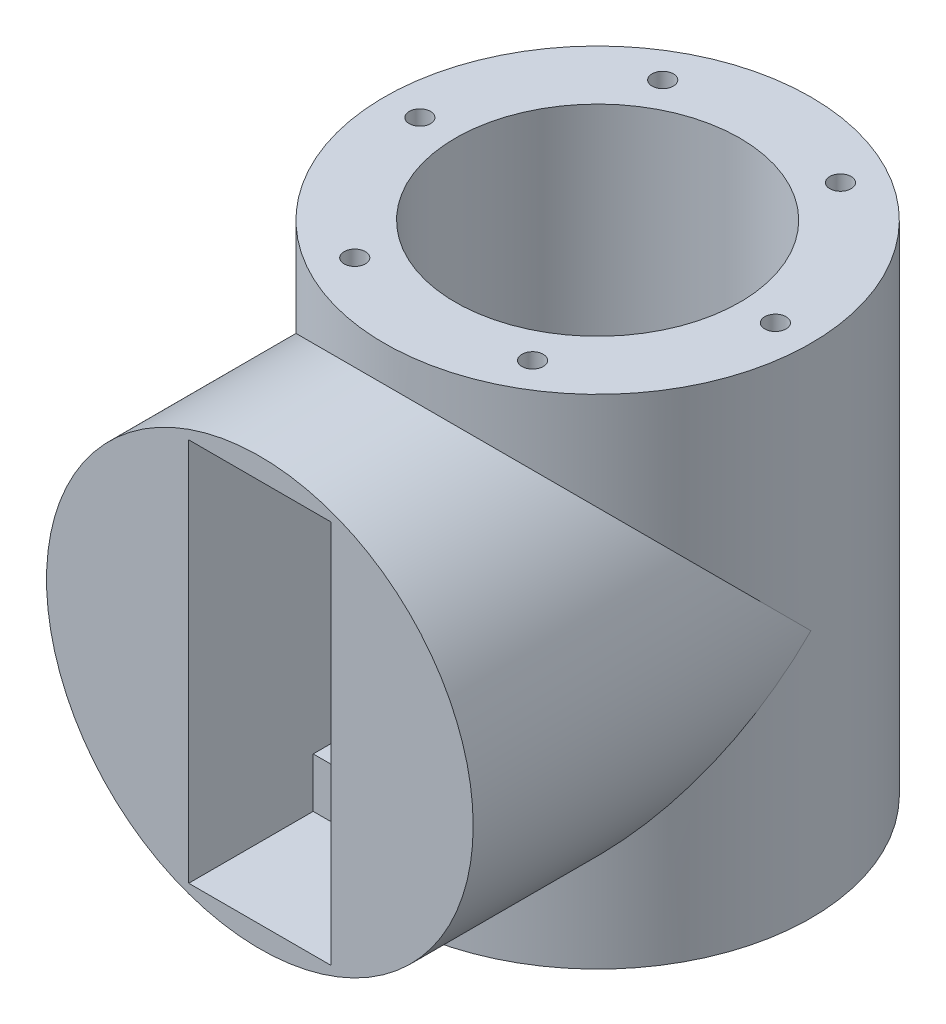
ISO-10303-21;
HEADER;
FILE_DESCRIPTION(('STEP AP214'),'2;1');
FILE_NAME('part.step','',(''),(''),'','','');
FILE_SCHEMA(('AUTOMOTIVE_DESIGN { 1 0 10303 214 1 1 1 1 }'));
ENDSEC;
DATA;
#1=APPLICATION_CONTEXT('core data for automotive mechanical design processes');
#2=APPLICATION_PROTOCOL_DEFINITION('international standard','automotive_design',2000,#1);
#3=PRODUCT_CONTEXT('',#1,'mechanical');
#4=PRODUCT('Part','Part','',(#3));
#5=PRODUCT_RELATED_PRODUCT_CATEGORY('part','',(#4));
#6=PRODUCT_DEFINITION_FORMATION('','',#4);
#7=PRODUCT_DEFINITION_CONTEXT('part definition',#1,'design');
#8=PRODUCT_DEFINITION('design','',#6,#7);
#9=PRODUCT_DEFINITION_SHAPE('','',#8);
#10=(LENGTH_UNIT() NAMED_UNIT(*) SI_UNIT(.MILLI.,.METRE.));
#11=(NAMED_UNIT(*) PLANE_ANGLE_UNIT() SI_UNIT($,.RADIAN.));
#12=(NAMED_UNIT(*) SI_UNIT($,.STERADIAN.) SOLID_ANGLE_UNIT());
#13=UNCERTAINTY_MEASURE_WITH_UNIT(LENGTH_MEASURE(1.E-05),#10,'distance_accuracy_value','');
#14=(GEOMETRIC_REPRESENTATION_CONTEXT(3) GLOBAL_UNCERTAINTY_ASSIGNED_CONTEXT((#13)) GLOBAL_UNIT_ASSIGNED_CONTEXT((#10,
#11,#12)) REPRESENTATION_CONTEXT('',''));
#15=CARTESIAN_POINT('',(0.,0.,0.));
#16=DIRECTION('',(0.,0.,1.));
#17=DIRECTION('',(1.,0.,0.));
#18=AXIS2_PLACEMENT_3D('',#15,#16,#17);
#19=CARTESIAN_POINT('',(-10.,55.,-30.001));
#20=DIRECTION('',(0.,1.,0.));
#21=DIRECTION('',(-1.,0.,0.));
#22=AXIS2_PLACEMENT_3D('',#19,#20,#21);
#23=PLANE('',#22);
#24=DIRECTION('',(1.,0.,0.));
#25=VECTOR('',#24,1.);
#26=CARTESIAN_POINT('',(-10.,55.,30.));
#27=LINE('',#26,#25);
#28=CARTESIAN_POINT('',(-10.,55.,30.));
#29=VERTEX_POINT('',#28);
#30=CARTESIAN_POINT('',(10.,55.,30.));
#31=VERTEX_POINT('',#30);
#32=EDGE_CURVE('E143',#29,#31,#27,.T.);
#33=ORIENTED_EDGE('',*,*,#32,.F.);
#34=DIRECTION('',(0.,0.,1.));
#35=VECTOR('',#34,1.);
#36=CARTESIAN_POINT('',(-10.,55.,-30.001));
#37=LINE('',#36,#35);
#38=CARTESIAN_POINT('',(-10.,55.,17.3205080756888));
#39=VERTEX_POINT('',#38);
#40=EDGE_CURVE('E162',#39,#29,#37,.T.);
#41=ORIENTED_EDGE('',*,*,#40,.F.);
#42=CARTESIAN_POINT('',(0.,55.,0.));
#43=DIRECTION('',(0.,1.,0.));
#44=DIRECTION('',(-1.,0.,0.));
#45=AXIS2_PLACEMENT_3D('',#42,#43,#44);
#46=CIRCLE('',#45,20.);
#47=CARTESIAN_POINT('',(10.,55.,17.3205080756888));
#48=VERTEX_POINT('',#47);
#49=EDGE_CURVE('E164',#48,#39,#46,.F.);
#50=ORIENTED_EDGE('',*,*,#49,.F.);
#51=DIRECTION('',(0.,0.,1.));
#52=VECTOR('',#51,1.);
#53=CARTESIAN_POINT('',(9.99999999999999,55.,-30.001));
#54=LINE('',#53,#52);
#55=EDGE_CURVE('E161',#48,#31,#54,.T.);
#56=ORIENTED_EDGE('',*,*,#55,.T.);
#57=EDGE_LOOP('',(#33,#41,#50,#56));
#58=FACE_BOUND('',#57,.T.);
#59=ADVANCED_FACE('F37',(#58),#23,.F.);
#60=CARTESIAN_POINT('',(-10.,15.,-30.001));
#61=DIRECTION('',(0.,-1.,0.));
#62=DIRECTION('',(0.,0.,-1.));
#63=AXIS2_PLACEMENT_3D('',#60,#61,#62);
#64=PLANE('',#63);
#65=DIRECTION('',(-1.,0.,0.));
#66=VECTOR('',#65,1.);
#67=CARTESIAN_POINT('',(-10.,15.,30.));
#68=LINE('',#67,#66);
#69=CARTESIAN_POINT('',(10.,15.,30.));
#70=VERTEX_POINT('',#69);
#71=CARTESIAN_POINT('',(-10.,15.,30.));
#72=VERTEX_POINT('',#71);
#73=EDGE_CURVE('E11',#70,#72,#68,.T.);
#74=ORIENTED_EDGE('',*,*,#73,.F.);
#75=DIRECTION('',(0.,0.,1.));
#76=VECTOR('',#75,1.);
#77=CARTESIAN_POINT('',(10.,15.,-30.001));
#78=LINE('',#77,#76);
#79=CARTESIAN_POINT('',(10.,15.,17.3205080756888));
#80=VERTEX_POINT('',#79);
#81=EDGE_CURVE('E154',#80,#70,#78,.T.);
#82=ORIENTED_EDGE('',*,*,#81,.F.);
#83=CARTESIAN_POINT('',(0.,15.,0.));
#84=DIRECTION('',(0.,-1.,0.));
#85=DIRECTION('',(0.,0.,-1.));
#86=AXIS2_PLACEMENT_3D('',#83,#84,#85);
#87=CIRCLE('',#86,20.);
#88=CARTESIAN_POINT('',(-10.,15.,17.3205080756888));
#89=VERTEX_POINT('',#88);
#90=EDGE_CURVE('E171',#89,#80,#87,.F.);
#91=ORIENTED_EDGE('',*,*,#90,.F.);
#92=DIRECTION('',(0.,0.,1.));
#93=VECTOR('',#92,1.);
#94=CARTESIAN_POINT('',(-10.,15.,-30.001));
#95=LINE('',#94,#93);
#96=EDGE_CURVE('E157',#89,#72,#95,.T.);
#97=ORIENTED_EDGE('',*,*,#96,.T.);
#98=EDGE_LOOP('',(#74,#82,#91,#97));
#99=FACE_BOUND('',#98,.T.);
#100=ADVANCED_FACE('F248',(#99),#64,.F.);
#101=CARTESIAN_POINT('',(0.,0.,0.));
#102=DIRECTION('',(0.,-1.,0.));
#103=DIRECTION('',(0.,0.,-1.));
#104=AXIS2_PLACEMENT_3D('',#101,#102,#103);
#105=CYLINDRICAL_SURFACE('',#104,30.);
#106=CARTESIAN_POINT('',(0.,70.,0.));
#107=DIRECTION('',(0.,-1.,0.));
#108=DIRECTION('',(0.,0.,-1.));
#109=AXIS2_PLACEMENT_3D('',#106,#107,#108);
#110=CIRCLE('',#109,30.);
#111=CARTESIAN_POINT('',(0.,70.,-30.));
#112=VERTEX_POINT('',#111);
#113=EDGE_CURVE('E226',#112,#112,#110,.T.);
#114=ORIENTED_EDGE('',*,*,#113,.T.);
#115=EDGE_LOOP('',(#114));
#116=FACE_BOUND('',#115,.T.);
#117=CARTESIAN_POINT('',(0.,0.,0.));
#118=DIRECTION('',(0.,-1.,0.));
#119=DIRECTION('',(0.,0.,-1.));
#120=AXIS2_PLACEMENT_3D('',#117,#118,#119);
#121=CIRCLE('',#120,30.);
#122=CARTESIAN_POINT('',(0.,0.,-30.));
#123=VERTEX_POINT('',#122);
#124=EDGE_CURVE('E223',#123,#123,#121,.T.);
#125=ORIENTED_EDGE('',*,*,#124,.F.);
#126=EDGE_LOOP('',(#125));
#127=FACE_BOUND('',#126,.T.);
#128=CARTESIAN_POINT('',(0.,35.,0.));
#129=DIRECTION('',(0.,-0.707106781186547,0.707106781186547));
#130=DIRECTION('',(0.,0.707106781186547,0.707106781186547));
#131=AXIS2_PLACEMENT_3D('',#128,#129,#130);
#132=ELLIPSE('',#131,42.4264068711928,30.);
#133=CARTESIAN_POINT('',(-30.,35.,0.));
#134=VERTEX_POINT('',#133);
#135=CARTESIAN_POINT('',(30.,35.,0.));
#136=VERTEX_POINT('',#135);
#137=EDGE_CURVE('E152',#134,#136,#132,.F.);
#138=ORIENTED_EDGE('',*,*,#137,.T.);
#139=CARTESIAN_POINT('',(0.,35.,0.));
#140=DIRECTION('',(0.,0.707106781186547,0.707106781186547));
#141=DIRECTION('',(0.,-0.707106781186547,0.707106781186547));
#142=AXIS2_PLACEMENT_3D('',#139,#140,#141);
#143=ELLIPSE('',#142,42.4264068711928,30.);
#144=EDGE_CURVE('E176',#136,#134,#143,.F.);
#145=ORIENTED_EDGE('',*,*,#144,.T.);
#146=EDGE_LOOP('',(#138,#145));
#147=FACE_BOUND('',#146,.T.);
#148=ADVANCED_FACE('F243',(#116,#127,#147),#105,.T.);
#149=CARTESIAN_POINT('',(0.,12.,-20.));
#150=DIRECTION('',(0.,1.,0.));
#151=DIRECTION('',(0.,0.,1.));
#152=AXIS2_PLACEMENT_3D('',#149,#150,#151);
#153=PLANE('',#152);
#154=CARTESIAN_POINT('',(0.,12.,-7.));
#155=DIRECTION('',(0.,1.,0.));
#156=DIRECTION('',(0.,0.,1.));
#157=AXIS2_PLACEMENT_3D('',#154,#155,#156);
#158=CIRCLE('',#157,1.5);
#159=CARTESIAN_POINT('',(0.,12.,-5.5));
#160=VERTEX_POINT('',#159);
#161=EDGE_CURVE('E200',#160,#160,#158,.T.);
#162=ORIENTED_EDGE('',*,*,#161,.F.);
#163=EDGE_LOOP('',(#162));
#164=FACE_BOUND('',#163,.T.);
#165=CARTESIAN_POINT('',(7.00000000000017,12.,-1.73225717501821E-13));
#166=DIRECTION('',(0.,1.,0.));
#167=DIRECTION('',(0.,0.,1.));
#168=AXIS2_PLACEMENT_3D('',#165,#166,#167);
#169=CIRCLE('',#168,1.50000000000014);
#170=CARTESIAN_POINT('',(7.00000000000017,12.,1.49999999999997));
#171=VERTEX_POINT('',#170);
#172=EDGE_CURVE('E201',#171,#171,#169,.T.);
#173=ORIENTED_EDGE('',*,*,#172,.F.);
#174=EDGE_LOOP('',(#173));
#175=FACE_BOUND('',#174,.T.);
#176=CARTESIAN_POINT('',(3.46451435003643E-13,12.,7.));
#177=DIRECTION('',(0.,1.,0.));
#178=DIRECTION('',(0.,0.,1.));
#179=AXIS2_PLACEMENT_3D('',#176,#177,#178);
#180=CIRCLE('',#179,1.50000000000038);
#181=CARTESIAN_POINT('',(3.46451435003643E-13,12.,8.50000000000038));
#182=VERTEX_POINT('',#181);
#183=EDGE_CURVE('E188',#182,#182,#180,.T.);
#184=ORIENTED_EDGE('',*,*,#183,.F.);
#185=EDGE_LOOP('',(#184));
#186=FACE_BOUND('',#185,.T.);
#187=CARTESIAN_POINT('',(-6.99999999999983,12.,1.74082970261225E-13));
#188=DIRECTION('',(0.,1.,0.));
#189=DIRECTION('',(0.,0.,1.));
#190=AXIS2_PLACEMENT_3D('',#187,#188,#189);
#191=CIRCLE('',#190,1.50000000000029);
#192=CARTESIAN_POINT('',(-6.99999999999983,12.,1.50000000000046));
#193=VERTEX_POINT('',#192);
#194=EDGE_CURVE('E189',#193,#193,#191,.T.);
#195=ORIENTED_EDGE('',*,*,#194,.F.);
#196=EDGE_LOOP('',(#195));
#197=FACE_BOUND('',#196,.T.);
#198=CARTESIAN_POINT('',(0.,12.,0.));
#199=DIRECTION('',(0.,-1.,0.));
#200=DIRECTION('',(0.,0.,-1.));
#201=AXIS2_PLACEMENT_3D('',#198,#199,#200);
#202=CIRCLE('',#201,20.);
#203=CARTESIAN_POINT('',(0.,12.,-20.));
#204=VERTEX_POINT('',#203);
#205=EDGE_CURVE('E214',#204,#204,#202,.T.);
#206=ORIENTED_EDGE('',*,*,#205,.F.);
#207=EDGE_LOOP('',(#206));
#208=FACE_BOUND('',#207,.T.);
#209=CARTESIAN_POINT('',(0.,12.,0.));
#210=DIRECTION('',(0.,1.,0.));
#211=DIRECTION('',(0.,0.,1.));
#212=AXIS2_PLACEMENT_3D('',#209,#210,#211);
#213=CIRCLE('',#212,3.);
#214=CARTESIAN_POINT('',(0.,12.,3.));
#215=VERTEX_POINT('',#214);
#216=EDGE_CURVE('E211',#215,#215,#213,.T.);
#217=ORIENTED_EDGE('',*,*,#216,.F.);
#218=EDGE_LOOP('',(#217));
#219=FACE_BOUND('',#218,.T.);
#220=ADVANCED_FACE('F235',(#164,#175,#186,#197,#208,#219),#153,.T.);
#221=CARTESIAN_POINT('',(0.,0.,0.));
#222=DIRECTION('',(0.,-1.,0.));
#223=DIRECTION('',(0.,0.,-1.));
#224=AXIS2_PLACEMENT_3D('',#221,#222,#223);
#225=CYLINDRICAL_SURFACE('',#224,20.);
#226=DIRECTION('',(0.,-1.,0.));
#227=VECTOR('',#226,1.);
#228=CARTESIAN_POINT('',(-9.99999999999999,0.,17.3205080756888));
#229=LINE('',#228,#227);
#230=EDGE_CURVE('E149',#39,#89,#229,.T.);
#231=ORIENTED_EDGE('',*,*,#230,.T.);
#232=ORIENTED_EDGE('',*,*,#90,.T.);
#233=DIRECTION('',(0.,-1.,0.));
#234=VECTOR('',#233,1.);
#235=CARTESIAN_POINT('',(10.,0.,17.3205080756888));
#236=LINE('',#235,#234);
#237=EDGE_CURVE('E158',#80,#48,#236,.F.);
#238=ORIENTED_EDGE('',*,*,#237,.T.);
#239=ORIENTED_EDGE('',*,*,#49,.T.);
#240=EDGE_LOOP('',(#231,#232,#238,#239));
#241=FACE_BOUND('',#240,.T.);
#242=ORIENTED_EDGE('',*,*,#205,.T.);
#243=EDGE_LOOP('',(#242));
#244=FACE_BOUND('',#243,.T.);
#245=CARTESIAN_POINT('',(0.,70.,0.));
#246=DIRECTION('',(0.,-1.,0.));
#247=DIRECTION('',(0.,0.,-1.));
#248=AXIS2_PLACEMENT_3D('',#245,#246,#247);
#249=CIRCLE('',#248,20.);
#250=CARTESIAN_POINT('',(0.,70.,-20.));
#251=VERTEX_POINT('',#250);
#252=EDGE_CURVE('E45',#251,#251,#249,.T.);
#253=ORIENTED_EDGE('',*,*,#252,.F.);
#254=EDGE_LOOP('',(#253));
#255=FACE_BOUND('',#254,.T.);
#256=ADVANCED_FACE('F39',(#241,#244,#255),#225,.F.);
#257=CARTESIAN_POINT('',(0.,70.,-30.));
#258=DIRECTION('',(0.,1.,0.));
#259=DIRECTION('',(0.,0.,1.));
#260=AXIS2_PLACEMENT_3D('',#257,#258,#259);
#261=PLANE('',#260);
#262=CARTESIAN_POINT('',(-12.5000000000003,70.,21.6506350946108));
#263=DIRECTION('',(0.,1.,0.));
#264=DIRECTION('',(0.866025403784433,0.,0.50000000000001));
#265=AXIS2_PLACEMENT_3D('',#262,#263,#264);
#266=CIRCLE('',#265,1.5);
#267=CARTESIAN_POINT('',(-11.2009618943236,70.,22.4006350946108));
#268=VERTEX_POINT('',#267);
#269=EDGE_CURVE('E582',#268,#268,#266,.T.);
#270=ORIENTED_EDGE('',*,*,#269,.F.);
#271=EDGE_LOOP('',(#270));
#272=FACE_BOUND('',#271,.T.);
#273=CARTESIAN_POINT('',(12.4999999999998,70.,21.6506350946111));
#274=DIRECTION('',(0.,1.,0.));
#275=DIRECTION('',(0.866025403784443,0.,-0.499999999999992));
#276=AXIS2_PLACEMENT_3D('',#273,#274,#275);
#277=CIRCLE('',#276,1.5);
#278=CARTESIAN_POINT('',(13.7990381056765,70.,20.9006350946111));
#279=VERTEX_POINT('',#278);
#280=EDGE_CURVE('E581',#279,#279,#277,.T.);
#281=ORIENTED_EDGE('',*,*,#280,.F.);
#282=EDGE_LOOP('',(#281));
#283=FACE_BOUND('',#282,.T.);
#284=CARTESIAN_POINT('',(25.,70.,0.));
#285=DIRECTION('',(0.,1.,0.));
#286=DIRECTION('',(0.,0.,-1.));
#287=AXIS2_PLACEMENT_3D('',#284,#285,#286);
#288=CIRCLE('',#287,1.5);
#289=CARTESIAN_POINT('',(25.,70.,-1.5));
#290=VERTEX_POINT('',#289);
#291=EDGE_CURVE('E617',#290,#290,#288,.T.);
#292=ORIENTED_EDGE('',*,*,#291,.F.);
#293=EDGE_LOOP('',(#292));
#294=FACE_BOUND('',#293,.T.);
#295=CARTESIAN_POINT('',(12.5000000000001,70.,-21.6506350946109));
#296=DIRECTION('',(0.,1.,0.));
#297=DIRECTION('',(-0.866025403784436,0.,-0.500000000000004));
#298=AXIS2_PLACEMENT_3D('',#295,#296,#297);
#299=CIRCLE('',#298,1.5);
#300=CARTESIAN_POINT('',(11.2009618943234,70.,-22.4006350946109));
#301=VERTEX_POINT('',#300);
#302=EDGE_CURVE('E608',#301,#301,#299,.T.);
#303=ORIENTED_EDGE('',*,*,#302,.F.);
#304=EDGE_LOOP('',(#303));
#305=FACE_BOUND('',#304,.T.);
#306=CARTESIAN_POINT('',(-12.5,70.,-21.650635094611));
#307=DIRECTION('',(0.,1.,0.));
#308=DIRECTION('',(-0.86602540378444,0.,0.499999999999998));
#309=AXIS2_PLACEMENT_3D('',#306,#307,#308);
#310=CIRCLE('',#309,1.5);
#311=CARTESIAN_POINT('',(-13.7990381056766,70.,-20.900635094611));
#312=VERTEX_POINT('',#311);
#313=EDGE_CURVE('E595',#312,#312,#310,.T.);
#314=ORIENTED_EDGE('',*,*,#313,.F.);
#315=EDGE_LOOP('',(#314));
#316=FACE_BOUND('',#315,.T.);
#317=CARTESIAN_POINT('',(-25.,70.,0.));
#318=DIRECTION('',(0.,1.,0.));
#319=DIRECTION('',(0.,0.,1.));
#320=AXIS2_PLACEMENT_3D('',#317,#318,#319);
#321=CIRCLE('',#320,1.5);
#322=CARTESIAN_POINT('',(-25.,70.,1.5));
#323=VERTEX_POINT('',#322);
#324=EDGE_CURVE('E594',#323,#323,#321,.T.);
#325=ORIENTED_EDGE('',*,*,#324,.F.);
#326=EDGE_LOOP('',(#325));
#327=FACE_BOUND('',#326,.T.);
#328=ORIENTED_EDGE('',*,*,#252,.T.);
#329=EDGE_LOOP('',(#328));
#330=FACE_BOUND('',#329,.T.);
#331=ORIENTED_EDGE('',*,*,#113,.F.);
#332=EDGE_LOOP('',(#331));
#333=FACE_BOUND('',#332,.T.);
#334=ADVANCED_FACE('F231',(#272,#283,#294,#305,#316,#327,#330,#333),#261,.T.);
#335=CARTESIAN_POINT('',(0.,0.,-26.));
#336=DIRECTION('',(0.,-1.,0.));
#337=DIRECTION('',(0.,0.,-1.));
#338=AXIS2_PLACEMENT_3D('',#335,#336,#337);
#339=PLANE('',#338);
#340=ORIENTED_EDGE('',*,*,#124,.T.);
#341=EDGE_LOOP('',(#340));
#342=FACE_BOUND('',#341,.T.);
#343=CARTESIAN_POINT('',(0.,0.,0.));
#344=DIRECTION('',(0.,-1.,0.));
#345=DIRECTION('',(0.,0.,-1.));
#346=AXIS2_PLACEMENT_3D('',#343,#344,#345);
#347=CIRCLE('',#346,26.);
#348=CARTESIAN_POINT('',(0.,0.,-26.));
#349=VERTEX_POINT('',#348);
#350=EDGE_CURVE('E220',#349,#349,#347,.T.);
#351=ORIENTED_EDGE('',*,*,#350,.F.);
#352=EDGE_LOOP('',(#351));
#353=FACE_BOUND('',#352,.T.);
#354=ADVANCED_FACE('F241',(#342,#353),#339,.T.);
#355=CARTESIAN_POINT('',(0.,0.,0.));
#356=DIRECTION('',(0.,-1.,0.));
#357=DIRECTION('',(0.,0.,-1.));
#358=AXIS2_PLACEMENT_3D('',#355,#356,#357);
#359=CYLINDRICAL_SURFACE('',#358,26.);
#360=ORIENTED_EDGE('',*,*,#350,.T.);
#361=EDGE_LOOP('',(#360));
#362=FACE_BOUND('',#361,.T.);
#363=CARTESIAN_POINT('',(0.,7.,0.));
#364=DIRECTION('',(0.,-1.,0.));
#365=DIRECTION('',(0.,0.,-1.));
#366=AXIS2_PLACEMENT_3D('',#363,#364,#365);
#367=CIRCLE('',#366,26.);
#368=CARTESIAN_POINT('',(0.,7.,-26.));
#369=VERTEX_POINT('',#368);
#370=EDGE_CURVE('E217',#369,#369,#367,.T.);
#371=ORIENTED_EDGE('',*,*,#370,.F.);
#372=EDGE_LOOP('',(#371));
#373=FACE_BOUND('',#372,.T.);
#374=ADVANCED_FACE('F292',(#362,#373),#359,.F.);
#375=CARTESIAN_POINT('',(0.,7.,0.));
#376=DIRECTION('',(0.,-1.,0.));
#377=DIRECTION('',(0.,0.,-1.));
#378=AXIS2_PLACEMENT_3D('',#375,#376,#377);
#379=PLANE('',#378);
#380=CARTESIAN_POINT('',(0.,7.,-7.));
#381=DIRECTION('',(0.,1.,0.));
#382=DIRECTION('',(0.,0.,1.));
#383=AXIS2_PLACEMENT_3D('',#380,#381,#382);
#384=CIRCLE('',#383,1.5);
#385=CARTESIAN_POINT('',(0.,7.,-5.5));
#386=VERTEX_POINT('',#385);
#387=EDGE_CURVE('E197',#386,#386,#384,.T.);
#388=ORIENTED_EDGE('',*,*,#387,.T.);
#389=EDGE_LOOP('',(#388));
#390=FACE_BOUND('',#389,.T.);
#391=CARTESIAN_POINT('',(7.00000000000017,7.,-1.73225717501821E-13));
#392=DIRECTION('',(0.,1.,0.));
#393=DIRECTION('',(0.,0.,1.));
#394=AXIS2_PLACEMENT_3D('',#391,#392,#393);
#395=CIRCLE('',#394,1.50000000000014);
#396=CARTESIAN_POINT('',(7.00000000000017,7.,1.49999999999997));
#397=VERTEX_POINT('',#396);
#398=EDGE_CURVE('E192',#397,#397,#395,.T.);
#399=ORIENTED_EDGE('',*,*,#398,.T.);
#400=EDGE_LOOP('',(#399));
#401=FACE_BOUND('',#400,.T.);
#402=CARTESIAN_POINT('',(3.46451435003643E-13,7.,7.));
#403=DIRECTION('',(0.,1.,0.));
#404=DIRECTION('',(0.,0.,1.));
#405=AXIS2_PLACEMENT_3D('',#402,#403,#404);
#406=CIRCLE('',#405,1.50000000000038);
#407=CARTESIAN_POINT('',(3.46451435003643E-13,7.,8.50000000000038));
#408=VERTEX_POINT('',#407);
#409=EDGE_CURVE('E185',#408,#408,#406,.T.);
#410=ORIENTED_EDGE('',*,*,#409,.T.);
#411=EDGE_LOOP('',(#410));
#412=FACE_BOUND('',#411,.T.);
#413=CARTESIAN_POINT('',(-6.99999999999983,7.,1.74082970261225E-13));
#414=DIRECTION('',(0.,1.,0.));
#415=DIRECTION('',(0.,0.,1.));
#416=AXIS2_PLACEMENT_3D('',#413,#414,#415);
#417=CIRCLE('',#416,1.50000000000029);
#418=CARTESIAN_POINT('',(-6.99999999999983,7.,1.50000000000046));
#419=VERTEX_POINT('',#418);
#420=EDGE_CURVE('E184',#419,#419,#417,.T.);
#421=ORIENTED_EDGE('',*,*,#420,.T.);
#422=EDGE_LOOP('',(#421));
#423=FACE_BOUND('',#422,.T.);
#424=CARTESIAN_POINT('',(0.,7.,0.));
#425=DIRECTION('',(0.,1.,0.));
#426=DIRECTION('',(0.,0.,1.));
#427=AXIS2_PLACEMENT_3D('',#424,#425,#426);
#428=CIRCLE('',#427,3.);
#429=CARTESIAN_POINT('',(0.,7.,3.));
#430=VERTEX_POINT('',#429);
#431=EDGE_CURVE('E204',#430,#430,#428,.T.);
#432=ORIENTED_EDGE('',*,*,#431,.T.);
#433=EDGE_LOOP('',(#432));
#434=FACE_BOUND('',#433,.T.);
#435=ORIENTED_EDGE('',*,*,#370,.T.);
#436=EDGE_LOOP('',(#435));
#437=FACE_BOUND('',#436,.T.);
#438=ADVANCED_FACE('F278',(#390,#401,#412,#423,#434,#437),#379,.T.);
#439=CARTESIAN_POINT('',(-6.99999999999983,20.4852813742386,1.74082970261225E-13));
#440=DIRECTION('',(0.,-1.,0.));
#441=DIRECTION('',(0.,0.,-1.));
#442=AXIS2_PLACEMENT_3D('',#439,#440,#441);
#443=CYLINDRICAL_SURFACE('',#442,1.50000000000029);
#444=ORIENTED_EDGE('',*,*,#420,.F.);
#445=EDGE_LOOP('',(#444));
#446=FACE_BOUND('',#445,.T.);
#447=ORIENTED_EDGE('',*,*,#194,.T.);
#448=EDGE_LOOP('',(#447));
#449=FACE_BOUND('',#448,.T.);
#450=ADVANCED_FACE('F274',(#446,#449),#443,.F.);
#451=CARTESIAN_POINT('',(3.46451435003643E-13,20.4852813742386,7.));
#452=DIRECTION('',(0.,-1.,0.));
#453=DIRECTION('',(0.,0.,-1.));
#454=AXIS2_PLACEMENT_3D('',#451,#452,#453);
#455=CYLINDRICAL_SURFACE('',#454,1.50000000000038);
#456=ORIENTED_EDGE('',*,*,#409,.F.);
#457=EDGE_LOOP('',(#456));
#458=FACE_BOUND('',#457,.T.);
#459=ORIENTED_EDGE('',*,*,#183,.T.);
#460=EDGE_LOOP('',(#459));
#461=FACE_BOUND('',#460,.T.);
#462=ADVANCED_FACE('F270',(#458,#461),#455,.F.);
#463=CARTESIAN_POINT('',(7.00000000000017,20.4852813742386,-1.73225717501821E-13));
#464=DIRECTION('',(0.,-1.,0.));
#465=DIRECTION('',(0.,0.,-1.));
#466=AXIS2_PLACEMENT_3D('',#463,#464,#465);
#467=CYLINDRICAL_SURFACE('',#466,1.50000000000014);
#468=ORIENTED_EDGE('',*,*,#398,.F.);
#469=EDGE_LOOP('',(#468));
#470=FACE_BOUND('',#469,.T.);
#471=ORIENTED_EDGE('',*,*,#172,.T.);
#472=EDGE_LOOP('',(#471));
#473=FACE_BOUND('',#472,.T.);
#474=ADVANCED_FACE('F273',(#470,#473),#467,.F.);
#475=CARTESIAN_POINT('',(0.,20.4852813742386,-7.));
#476=DIRECTION('',(0.,-1.,0.));
#477=DIRECTION('',(0.,0.,-1.));
#478=AXIS2_PLACEMENT_3D('',#475,#476,#477);
#479=CYLINDRICAL_SURFACE('',#478,1.5);
#480=ORIENTED_EDGE('',*,*,#387,.F.);
#481=EDGE_LOOP('',(#480));
#482=FACE_BOUND('',#481,.T.);
#483=ORIENTED_EDGE('',*,*,#161,.T.);
#484=EDGE_LOOP('',(#483));
#485=FACE_BOUND('',#484,.T.);
#486=ADVANCED_FACE('F280',(#482,#485),#479,.F.);
#487=CARTESIAN_POINT('',(0.,20.4852813742386,0.));
#488=DIRECTION('',(0.,-1.,0.));
#489=DIRECTION('',(0.,0.,-1.));
#490=AXIS2_PLACEMENT_3D('',#487,#488,#489);
#491=CYLINDRICAL_SURFACE('',#490,3.);
#492=ORIENTED_EDGE('',*,*,#431,.F.);
#493=EDGE_LOOP('',(#492));
#494=FACE_BOUND('',#493,.T.);
#495=ORIENTED_EDGE('',*,*,#216,.T.);
#496=EDGE_LOOP('',(#495));
#497=FACE_BOUND('',#496,.T.);
#498=ADVANCED_FACE('F268',(#494,#497),#491,.F.);
#499=CARTESIAN_POINT('',(0.,35.,47.5));
#500=DIRECTION('',(0.,0.,-1.));
#501=DIRECTION('',(-1.,0.,0.));
#502=AXIS2_PLACEMENT_3D('',#499,#500,#501);
#503=CYLINDRICAL_SURFACE('',#502,30.);
#504=CARTESIAN_POINT('',(0.,35.,47.5));
#505=DIRECTION('',(0.,0.,1.));
#506=DIRECTION('',(1.,0.,0.));
#507=AXIS2_PLACEMENT_3D('',#504,#505,#506);
#508=CIRCLE('',#507,30.);
#509=CARTESIAN_POINT('',(30.,35.,47.5));
#510=VERTEX_POINT('',#509);
#511=EDGE_CURVE('E179',#510,#510,#508,.T.);
#512=ORIENTED_EDGE('',*,*,#511,.F.);
#513=EDGE_LOOP('',(#512));
#514=FACE_BOUND('',#513,.T.);
#515=ORIENTED_EDGE('',*,*,#144,.F.);
#516=ORIENTED_EDGE('',*,*,#137,.F.);
#517=EDGE_LOOP('',(#515,#516));
#518=FACE_BOUND('',#517,.T.);
#519=ADVANCED_FACE('F264',(#514,#518),#503,.T.);
#520=CARTESIAN_POINT('',(0.,35.,47.5));
#521=DIRECTION('',(0.,0.,1.));
#522=DIRECTION('',(1.,0.,0.));
#523=AXIS2_PLACEMENT_3D('',#520,#521,#522);
#524=PLANE('',#523);
#525=DIRECTION('',(0.,-1.,0.));
#526=VECTOR('',#525,1.);
#527=CARTESIAN_POINT('',(-10.,55.,47.5));
#528=LINE('',#527,#526);
#529=CARTESIAN_POINT('',(-10.,62.,47.5));
#530=VERTEX_POINT('',#529);
#531=CARTESIAN_POINT('',(-10.,8.00000000000001,47.5));
#532=VERTEX_POINT('',#531);
#533=EDGE_CURVE('E121',#530,#532,#528,.T.);
#534=ORIENTED_EDGE('',*,*,#533,.F.);
#535=DIRECTION('',(-1.,0.,0.));
#536=VECTOR('',#535,1.);
#537=CARTESIAN_POINT('',(-10.,62.,47.5));
#538=LINE('',#537,#536);
#539=CARTESIAN_POINT('',(9.99999999999999,62.,47.5));
#540=VERTEX_POINT('',#539);
#541=EDGE_CURVE('E115',#540,#530,#538,.T.);
#542=ORIENTED_EDGE('',*,*,#541,.F.);
#543=DIRECTION('',(0.,1.,0.));
#544=VECTOR('',#543,1.);
#545=CARTESIAN_POINT('',(9.99999999999999,55.,47.5));
#546=LINE('',#545,#544);
#547=CARTESIAN_POINT('',(10.,8.00000000000001,47.5));
#548=VERTEX_POINT('',#547);
#549=EDGE_CURVE('E150',#548,#540,#546,.T.);
#550=ORIENTED_EDGE('',*,*,#549,.F.);
#551=DIRECTION('',(1.,0.,0.));
#552=VECTOR('',#551,1.);
#553=CARTESIAN_POINT('',(-10.,8.00000000000001,47.5));
#554=LINE('',#553,#552);
#555=EDGE_CURVE('E136',#532,#548,#554,.T.);
#556=ORIENTED_EDGE('',*,*,#555,.F.);
#557=EDGE_LOOP('',(#534,#542,#550,#556));
#558=FACE_BOUND('',#557,.T.);
#559=ORIENTED_EDGE('',*,*,#511,.T.);
#560=EDGE_LOOP('',(#559));
#561=FACE_BOUND('',#560,.T.);
#562=ADVANCED_FACE('F261',(#558,#561),#524,.T.);
#563=CARTESIAN_POINT('',(-10.,55.,-30.001));
#564=DIRECTION('',(-1.,0.,0.));
#565=DIRECTION('',(0.,-1.,0.));
#566=AXIS2_PLACEMENT_3D('',#563,#564,#565);
#567=PLANE('',#566);
#568=ORIENTED_EDGE('',*,*,#533,.T.);
#569=DIRECTION('',(0.,0.,1.));
#570=VECTOR('',#569,1.);
#571=CARTESIAN_POINT('',(-10.,8.00000000000001,30.));
#572=LINE('',#571,#570);
#573=CARTESIAN_POINT('',(-10.,8.00000000000001,30.));
#574=VERTEX_POINT('',#573);
#575=EDGE_CURVE('E118',#574,#532,#572,.T.);
#576=ORIENTED_EDGE('',*,*,#575,.F.);
#577=DIRECTION('',(0.,-1.,0.));
#578=VECTOR('',#577,1.);
#579=CARTESIAN_POINT('',(-10.,62.,30.));
#580=LINE('',#579,#578);
#581=EDGE_CURVE('E107',#72,#574,#580,.T.);
#582=ORIENTED_EDGE('',*,*,#581,.F.);
#583=ORIENTED_EDGE('',*,*,#96,.F.);
#584=ORIENTED_EDGE('',*,*,#230,.F.);
#585=ORIENTED_EDGE('',*,*,#40,.T.);
#586=CARTESIAN_POINT('',(-10.,62.,30.));
#587=VERTEX_POINT('',#586);
#588=EDGE_CURVE('E52',#587,#29,#580,.T.);
#589=ORIENTED_EDGE('',*,*,#588,.F.);
#590=DIRECTION('',(0.,0.,1.));
#591=VECTOR('',#590,1.);
#592=CARTESIAN_POINT('',(-10.,62.,30.));
#593=LINE('',#592,#591);
#594=EDGE_CURVE('E141',#587,#530,#593,.T.);
#595=ORIENTED_EDGE('',*,*,#594,.T.);
#596=EDGE_LOOP('',(#568,#576,#582,#583,#584,#585,#589,#595));
#597=FACE_BOUND('',#596,.T.);
#598=ADVANCED_FACE('F119',(#597),#567,.F.);
#599=CARTESIAN_POINT('',(9.99999999999999,55.,-30.001));
#600=DIRECTION('',(1.,0.,0.));
#601=DIRECTION('',(0.,1.,0.));
#602=AXIS2_PLACEMENT_3D('',#599,#600,#601);
#603=PLANE('',#602);
#604=ORIENTED_EDGE('',*,*,#549,.T.);
#605=DIRECTION('',(0.,0.,1.));
#606=VECTOR('',#605,1.);
#607=CARTESIAN_POINT('',(9.99999999999999,62.,30.));
#608=LINE('',#607,#606);
#609=CARTESIAN_POINT('',(9.99999999999999,62.,30.));
#610=VERTEX_POINT('',#609);
#611=EDGE_CURVE('E144',#610,#540,#608,.T.);
#612=ORIENTED_EDGE('',*,*,#611,.F.);
#613=DIRECTION('',(0.,1.,0.));
#614=VECTOR('',#613,1.);
#615=CARTESIAN_POINT('',(9.99999999999999,62.,30.));
#616=LINE('',#615,#614);
#617=EDGE_CURVE('E130',#31,#610,#616,.T.);
#618=ORIENTED_EDGE('',*,*,#617,.F.);
#619=ORIENTED_EDGE('',*,*,#55,.F.);
#620=ORIENTED_EDGE('',*,*,#237,.F.);
#621=ORIENTED_EDGE('',*,*,#81,.T.);
#622=CARTESIAN_POINT('',(10.,8.00000000000001,30.));
#623=VERTEX_POINT('',#622);
#624=EDGE_CURVE('E59',#623,#70,#616,.T.);
#625=ORIENTED_EDGE('',*,*,#624,.F.);
#626=DIRECTION('',(0.,0.,1.));
#627=VECTOR('',#626,1.);
#628=CARTESIAN_POINT('',(10.,8.00000000000001,30.));
#629=LINE('',#628,#627);
#630=EDGE_CURVE('E125',#623,#548,#629,.T.);
#631=ORIENTED_EDGE('',*,*,#630,.T.);
#632=EDGE_LOOP('',(#604,#612,#618,#619,#620,#621,#625,#631));
#633=FACE_BOUND('',#632,.T.);
#634=ADVANCED_FACE('F258',(#633),#603,.F.);
#635=CARTESIAN_POINT('',(0.,0.,30.));
#636=DIRECTION('',(0.,0.,1.));
#637=DIRECTION('',(1.,0.,0.));
#638=AXIS2_PLACEMENT_3D('',#635,#636,#637);
#639=PLANE('',#638);
#640=ORIENTED_EDGE('',*,*,#73,.T.);
#641=ORIENTED_EDGE('',*,*,#581,.T.);
#642=DIRECTION('',(1.,0.,0.));
#643=VECTOR('',#642,1.);
#644=CARTESIAN_POINT('',(-10.,8.00000000000001,30.));
#645=LINE('',#644,#643);
#646=EDGE_CURVE('E111',#574,#623,#645,.T.);
#647=ORIENTED_EDGE('',*,*,#646,.T.);
#648=ORIENTED_EDGE('',*,*,#624,.T.);
#649=EDGE_LOOP('',(#640,#641,#647,#648));
#650=FACE_BOUND('',#649,.T.);
#651=ADVANCED_FACE('F109',(#650),#639,.T.);
#652=CARTESIAN_POINT('',(-10.,8.00000000000001,30.));
#653=DIRECTION('',(0.,-1.,0.));
#654=DIRECTION('',(0.,0.,-1.));
#655=AXIS2_PLACEMENT_3D('',#652,#653,#654);
#656=PLANE('',#655);
#657=ORIENTED_EDGE('',*,*,#555,.T.);
#658=ORIENTED_EDGE('',*,*,#630,.F.);
#659=ORIENTED_EDGE('',*,*,#646,.F.);
#660=ORIENTED_EDGE('',*,*,#575,.T.);
#661=EDGE_LOOP('',(#657,#658,#659,#660));
#662=FACE_BOUND('',#661,.T.);
#663=ADVANCED_FACE('F128',(#662),#656,.F.);
#664=ORIENTED_EDGE('',*,*,#32,.T.);
#665=ORIENTED_EDGE('',*,*,#617,.T.);
#666=DIRECTION('',(-1.,0.,0.));
#667=VECTOR('',#666,1.);
#668=CARTESIAN_POINT('',(-10.,62.,30.));
#669=LINE('',#668,#667);
#670=EDGE_CURVE('E126',#610,#587,#669,.T.);
#671=ORIENTED_EDGE('',*,*,#670,.T.);
#672=ORIENTED_EDGE('',*,*,#588,.T.);
#673=EDGE_LOOP('',(#664,#665,#671,#672));
#674=FACE_BOUND('',#673,.T.);
#675=ADVANCED_FACE('F387',(#674),#639,.T.);
#676=CARTESIAN_POINT('',(-10.,62.,30.));
#677=DIRECTION('',(0.,1.,0.));
#678=DIRECTION('',(0.,0.,1.));
#679=AXIS2_PLACEMENT_3D('',#676,#677,#678);
#680=PLANE('',#679);
#681=ORIENTED_EDGE('',*,*,#541,.T.);
#682=ORIENTED_EDGE('',*,*,#594,.F.);
#683=ORIENTED_EDGE('',*,*,#670,.F.);
#684=ORIENTED_EDGE('',*,*,#611,.T.);
#685=EDGE_LOOP('',(#681,#682,#683,#684));
#686=FACE_BOUND('',#685,.T.);
#687=ADVANCED_FACE('F399',(#686),#680,.F.);
#688=CARTESIAN_POINT('',(-25.,63.,0.));
#689=DIRECTION('',(0.,1.,0.));
#690=DIRECTION('',(0.,0.,1.));
#691=AXIS2_PLACEMENT_3D('',#688,#689,#690);
#692=CYLINDRICAL_SURFACE('',#691,1.5);
#693=CARTESIAN_POINT('',(-25.,63.,0.));
#694=DIRECTION('',(0.,1.,0.));
#695=DIRECTION('',(0.,0.,1.));
#696=AXIS2_PLACEMENT_3D('',#693,#694,#695);
#697=CIRCLE('',#696,1.5);
#698=CARTESIAN_POINT('',(-25.,63.,1.5));
#699=VERTEX_POINT('',#698);
#700=EDGE_CURVE('E138',#699,#699,#697,.T.);
#701=ORIENTED_EDGE('',*,*,#700,.F.);
#702=EDGE_LOOP('',(#701));
#703=FACE_BOUND('',#702,.T.);
#704=ORIENTED_EDGE('',*,*,#324,.T.);
#705=EDGE_LOOP('',(#704));
#706=FACE_BOUND('',#705,.T.);
#707=ADVANCED_FACE('F405',(#703,#706),#692,.F.);
#708=CARTESIAN_POINT('',(-25.,63.,0.));
#709=DIRECTION('',(0.,1.,0.));
#710=DIRECTION('',(0.,0.,1.));
#711=AXIS2_PLACEMENT_3D('',#708,#709,#710);
#712=PLANE('',#711);
#713=ORIENTED_EDGE('',*,*,#700,.T.);
#714=EDGE_LOOP('',(#713));
#715=FACE_BOUND('',#714,.T.);
#716=ADVANCED_FACE('F413',(#715),#712,.T.);
#717=CARTESIAN_POINT('',(-12.5,63.,-21.650635094611));
#718=DIRECTION('',(0.,1.,0.));
#719=DIRECTION('',(0.,0.,1.));
#720=AXIS2_PLACEMENT_3D('',#717,#718,#719);
#721=CYLINDRICAL_SURFACE('',#720,1.5);
#722=CARTESIAN_POINT('',(-12.5,63.,-21.650635094611));
#723=DIRECTION('',(0.,1.,0.));
#724=DIRECTION('',(-0.86602540378444,0.,0.499999999999998));
#725=AXIS2_PLACEMENT_3D('',#722,#723,#724);
#726=CIRCLE('',#725,1.5);
#727=CARTESIAN_POINT('',(-13.7990381056766,63.,-20.900635094611));
#728=VERTEX_POINT('',#727);
#729=EDGE_CURVE('E591',#728,#728,#726,.T.);
#730=ORIENTED_EDGE('',*,*,#729,.F.);
#731=EDGE_LOOP('',(#730));
#732=FACE_BOUND('',#731,.T.);
#733=ORIENTED_EDGE('',*,*,#313,.T.);
#734=EDGE_LOOP('',(#733));
#735=FACE_BOUND('',#734,.T.);
#736=ADVANCED_FACE('F421',(#732,#735),#721,.F.);
#737=CARTESIAN_POINT('',(-12.5,63.,-21.650635094611));
#738=DIRECTION('',(0.,1.,0.));
#739=DIRECTION('',(-0.86602540378444,0.,0.499999999999998));
#740=AXIS2_PLACEMENT_3D('',#737,#738,#739);
#741=PLANE('',#740);
#742=ORIENTED_EDGE('',*,*,#729,.T.);
#743=EDGE_LOOP('',(#742));
#744=FACE_BOUND('',#743,.T.);
#745=ADVANCED_FACE('F430',(#744),#741,.T.);
#746=CARTESIAN_POINT('',(12.5000000000001,63.,-21.6506350946109));
#747=DIRECTION('',(0.,1.,0.));
#748=DIRECTION('',(0.,0.,1.));
#749=AXIS2_PLACEMENT_3D('',#746,#747,#748);
#750=CYLINDRICAL_SURFACE('',#749,1.5);
#751=CARTESIAN_POINT('',(12.5000000000001,63.,-21.6506350946109));
#752=DIRECTION('',(0.,1.,0.));
#753=DIRECTION('',(-0.866025403784436,0.,-0.500000000000004));
#754=AXIS2_PLACEMENT_3D('',#751,#752,#753);
#755=CIRCLE('',#754,1.5);
#756=CARTESIAN_POINT('',(11.2009618943234,63.,-22.4006350946109));
#757=VERTEX_POINT('',#756);
#758=EDGE_CURVE('E598',#757,#757,#755,.T.);
#759=ORIENTED_EDGE('',*,*,#758,.F.);
#760=EDGE_LOOP('',(#759));
#761=FACE_BOUND('',#760,.T.);
#762=ORIENTED_EDGE('',*,*,#302,.T.);
#763=EDGE_LOOP('',(#762));
#764=FACE_BOUND('',#763,.T.);
#765=ADVANCED_FACE('F438',(#761,#764),#750,.F.);
#766=CARTESIAN_POINT('',(12.5000000000001,63.,-21.6506350946109));
#767=DIRECTION('',(0.,1.,0.));
#768=DIRECTION('',(-0.866025403784436,0.,-0.500000000000004));
#769=AXIS2_PLACEMENT_3D('',#766,#767,#768);
#770=PLANE('',#769);
#771=ORIENTED_EDGE('',*,*,#758,.T.);
#772=EDGE_LOOP('',(#771));
#773=FACE_BOUND('',#772,.T.);
#774=ADVANCED_FACE('F446',(#773),#770,.T.);
#775=CARTESIAN_POINT('',(25.,63.,0.));
#776=DIRECTION('',(0.,1.,0.));
#777=DIRECTION('',(0.,0.,1.));
#778=AXIS2_PLACEMENT_3D('',#775,#776,#777);
#779=CYLINDRICAL_SURFACE('',#778,1.5);
#780=CARTESIAN_POINT('',(25.,63.,0.));
#781=DIRECTION('',(0.,1.,0.));
#782=DIRECTION('',(0.,0.,-1.));
#783=AXIS2_PLACEMENT_3D('',#780,#781,#782);
#784=CIRCLE('',#783,1.5);
#785=CARTESIAN_POINT('',(25.,63.,-1.5));
#786=VERTEX_POINT('',#785);
#787=EDGE_CURVE('E612',#786,#786,#784,.T.);
#788=ORIENTED_EDGE('',*,*,#787,.F.);
#789=EDGE_LOOP('',(#788));
#790=FACE_BOUND('',#789,.T.);
#791=ORIENTED_EDGE('',*,*,#291,.T.);
#792=EDGE_LOOP('',(#791));
#793=FACE_BOUND('',#792,.T.);
#794=ADVANCED_FACE('F454',(#790,#793),#779,.F.);
#795=CARTESIAN_POINT('',(25.,63.,0.));
#796=DIRECTION('',(0.,1.,0.));
#797=DIRECTION('',(0.,0.,-1.));
#798=AXIS2_PLACEMENT_3D('',#795,#796,#797);
#799=PLANE('',#798);
#800=ORIENTED_EDGE('',*,*,#787,.T.);
#801=EDGE_LOOP('',(#800));
#802=FACE_BOUND('',#801,.T.);
#803=ADVANCED_FACE('F462',(#802),#799,.T.);
#804=CARTESIAN_POINT('',(12.4999999999998,63.,21.6506350946111));
#805=DIRECTION('',(0.,1.,0.));
#806=DIRECTION('',(0.,0.,1.));
#807=AXIS2_PLACEMENT_3D('',#804,#805,#806);
#808=CYLINDRICAL_SURFACE('',#807,1.5);
#809=CARTESIAN_POINT('',(12.4999999999998,63.,21.6506350946111));
#810=DIRECTION('',(0.,1.,0.));
#811=DIRECTION('',(0.866025403784443,0.,-0.499999999999992));
#812=AXIS2_PLACEMENT_3D('',#809,#810,#811);
#813=CIRCLE('',#812,1.5);
#814=CARTESIAN_POINT('',(13.7990381056765,63.,20.9006350946111));
#815=VERTEX_POINT('',#814);
#816=EDGE_CURVE('E585',#815,#815,#813,.T.);
#817=ORIENTED_EDGE('',*,*,#816,.F.);
#818=EDGE_LOOP('',(#817));
#819=FACE_BOUND('',#818,.T.);
#820=ORIENTED_EDGE('',*,*,#280,.T.);
#821=EDGE_LOOP('',(#820));
#822=FACE_BOUND('',#821,.T.);
#823=ADVANCED_FACE('F470',(#819,#822),#808,.F.);
#824=CARTESIAN_POINT('',(12.4999999999998,63.,21.6506350946111));
#825=DIRECTION('',(0.,1.,0.));
#826=DIRECTION('',(0.866025403784443,0.,-0.499999999999992));
#827=AXIS2_PLACEMENT_3D('',#824,#825,#826);
#828=PLANE('',#827);
#829=ORIENTED_EDGE('',*,*,#816,.T.);
#830=EDGE_LOOP('',(#829));
#831=FACE_BOUND('',#830,.T.);
#832=ADVANCED_FACE('F478',(#831),#828,.T.);
#833=CARTESIAN_POINT('',(-12.5000000000003,63.,21.6506350946108));
#834=DIRECTION('',(0.,1.,0.));
#835=DIRECTION('',(0.,0.,1.));
#836=AXIS2_PLACEMENT_3D('',#833,#834,#835);
#837=CYLINDRICAL_SURFACE('',#836,1.5);
#838=CARTESIAN_POINT('',(-12.5000000000003,63.,21.6506350946108));
#839=DIRECTION('',(0.,1.,0.));
#840=DIRECTION('',(0.866025403784433,0.,0.50000000000001));
#841=AXIS2_PLACEMENT_3D('',#838,#839,#840);
#842=CIRCLE('',#841,1.5);
#843=CARTESIAN_POINT('',(-11.2009618943236,63.,22.4006350946108));
#844=VERTEX_POINT('',#843);
#845=EDGE_CURVE('E580',#844,#844,#842,.T.);
#846=ORIENTED_EDGE('',*,*,#845,.F.);
#847=EDGE_LOOP('',(#846));
#848=FACE_BOUND('',#847,.T.);
#849=ORIENTED_EDGE('',*,*,#269,.T.);
#850=EDGE_LOOP('',(#849));
#851=FACE_BOUND('',#850,.T.);
#852=ADVANCED_FACE('F486',(#848,#851),#837,.F.);
#853=CARTESIAN_POINT('',(-12.5000000000003,63.,21.6506350946108));
#854=DIRECTION('',(0.,1.,0.));
#855=DIRECTION('',(0.866025403784433,0.,0.50000000000001));
#856=AXIS2_PLACEMENT_3D('',#853,#854,#855);
#857=PLANE('',#856);
#858=ORIENTED_EDGE('',*,*,#845,.T.);
#859=EDGE_LOOP('',(#858));
#860=FACE_BOUND('',#859,.T.);
#861=ADVANCED_FACE('F494',(#860),#857,.T.);
#862=CLOSED_SHELL('',(#59,#100,#148,#220,#256,#334,#354,#374,#438,#450,#462,#474,#486,#498,#519,
#562,#598,#634,#651,#663,#675,#687,#707,#716,#736,#745,#765,#774,#794,#803,#823,#832,#852,#861));
#863=MANIFOLD_SOLID_BREP('B2',#862);
#864=ADVANCED_BREP_SHAPE_REPRESENTATION('',(#18,#863),#14);
#865=SHAPE_DEFINITION_REPRESENTATION(#9,#864);
ENDSEC;
END-ISO-10303-21;
